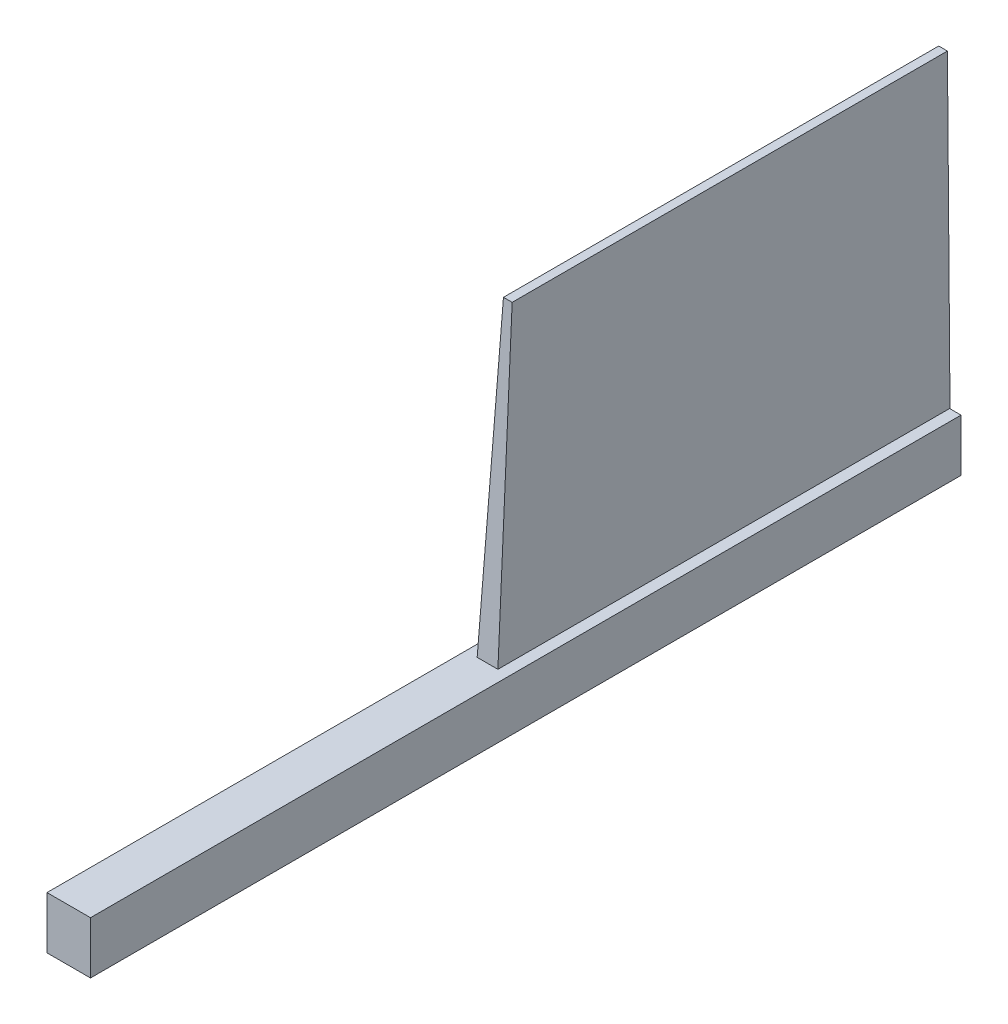
ISO-10303-21;
HEADER;
FILE_DESCRIPTION(('STEP AP214'),'2;1');
FILE_NAME('part.step','',(''),(''),'','','');
FILE_SCHEMA(('AUTOMOTIVE_DESIGN { 1 0 10303 214 1 1 1 1 }'));
ENDSEC;
DATA;
#1=APPLICATION_CONTEXT('core data for automotive mechanical design processes');
#2=APPLICATION_PROTOCOL_DEFINITION('international standard','automotive_design',2000,#1);
#3=PRODUCT_CONTEXT('',#1,'mechanical');
#4=PRODUCT('Part','Part','',(#3));
#5=PRODUCT_RELATED_PRODUCT_CATEGORY('part','',(#4));
#6=PRODUCT_DEFINITION_FORMATION('','',#4);
#7=PRODUCT_DEFINITION_CONTEXT('part definition',#1,'design');
#8=PRODUCT_DEFINITION('design','',#6,#7);
#9=PRODUCT_DEFINITION_SHAPE('','',#8);
#10=(LENGTH_UNIT() NAMED_UNIT(*) SI_UNIT(.MILLI.,.METRE.));
#11=(NAMED_UNIT(*) PLANE_ANGLE_UNIT() SI_UNIT($,.RADIAN.));
#12=(NAMED_UNIT(*) SI_UNIT($,.STERADIAN.) SOLID_ANGLE_UNIT());
#13=UNCERTAINTY_MEASURE_WITH_UNIT(LENGTH_MEASURE(1.E-05),#10,'distance_accuracy_value','');
#14=(GEOMETRIC_REPRESENTATION_CONTEXT(3) GLOBAL_UNCERTAINTY_ASSIGNED_CONTEXT((#13)) GLOBAL_UNIT_ASSIGNED_CONTEXT((#10,
#11,#12)) REPRESENTATION_CONTEXT('',''));
#15=CARTESIAN_POINT('',(0.,0.,0.));
#16=DIRECTION('',(0.,0.,1.));
#17=DIRECTION('',(1.,0.,0.));
#18=AXIS2_PLACEMENT_3D('',#15,#16,#17);
#19=CARTESIAN_POINT('',(-5.,5.99999999999999,200.));
#20=DIRECTION('',(0.,-1.,0.));
#21=DIRECTION('',(1.,0.,0.));
#22=AXIS2_PLACEMENT_3D('',#19,#20,#21);
#23=PLANE('',#22);
#24=DIRECTION('',(0.,0.,-1.));
#25=VECTOR('',#24,1.);
#26=CARTESIAN_POINT('',(2.38157894736841,5.99999999999999,200.));
#27=LINE('',#26,#25);
#28=CARTESIAN_POINT('',(2.38157894736844,5.99999999999994,103.783896454098));
#29=VERTEX_POINT('',#28);
#30=CARTESIAN_POINT('',(2.38157894736843,5.99999999999999,0.));
#31=VERTEX_POINT('',#30);
#32=EDGE_CURVE('E61',#29,#31,#27,.T.);
#33=ORIENTED_EDGE('',*,*,#32,.F.);
#34=DIRECTION('',(1.,0.,0.));
#35=VECTOR('',#34,1.);
#36=CARTESIAN_POINT('',(-5.00000000000001,5.99999999999994,103.783896454098));
#37=LINE('',#36,#35);
#38=CARTESIAN_POINT('',(-2.38157894736841,5.99999999999994,103.783896454098));
#39=VERTEX_POINT('',#38);
#40=EDGE_CURVE('E12',#39,#29,#37,.T.);
#41=ORIENTED_EDGE('',*,*,#40,.F.);
#42=DIRECTION('',(0.,0.,1.));
#43=VECTOR('',#42,1.);
#44=CARTESIAN_POINT('',(-2.38157894736842,5.99999999999999,200.));
#45=LINE('',#44,#43);
#46=CARTESIAN_POINT('',(-2.38157894736839,5.99999999999999,0.));
#47=VERTEX_POINT('',#46);
#48=EDGE_CURVE('E222',#47,#39,#45,.T.);
#49=ORIENTED_EDGE('',*,*,#48,.F.);
#50=DIRECTION('',(-1.,0.,0.));
#51=VECTOR('',#50,1.);
#52=CARTESIAN_POINT('',(-5.,6.00000000000001,0.));
#53=LINE('',#52,#51);
#54=CARTESIAN_POINT('',(-5.,6.00000000000001,0.));
#55=VERTEX_POINT('',#54);
#56=EDGE_CURVE('E236',#47,#55,#53,.T.);
#57=ORIENTED_EDGE('',*,*,#56,.T.);
#58=DIRECTION('',(0.,0.,-1.));
#59=VECTOR('',#58,1.);
#60=CARTESIAN_POINT('',(-5.,5.99999999999999,200.));
#61=LINE('',#60,#59);
#62=CARTESIAN_POINT('',(-5.,5.99999999999999,200.));
#63=VERTEX_POINT('',#62);
#64=EDGE_CURVE('E247',#63,#55,#61,.T.);
#65=ORIENTED_EDGE('',*,*,#64,.F.);
#66=DIRECTION('',(-1.,0.,0.));
#67=VECTOR('',#66,1.);
#68=CARTESIAN_POINT('',(-5.,5.99999999999999,200.));
#69=LINE('',#68,#67);
#70=CARTESIAN_POINT('',(5.,5.99999999999999,200.));
#71=VERTEX_POINT('',#70);
#72=EDGE_CURVE('E226',#71,#63,#69,.T.);
#73=ORIENTED_EDGE('',*,*,#72,.F.);
#74=DIRECTION('',(0.,0.,-1.));
#75=VECTOR('',#74,1.);
#76=CARTESIAN_POINT('',(5.,5.99999999999999,200.));
#77=LINE('',#76,#75);
#78=CARTESIAN_POINT('',(5.00000000000002,5.99999999999999,0.));
#79=VERTEX_POINT('',#78);
#80=EDGE_CURVE('E250',#71,#79,#77,.T.);
#81=ORIENTED_EDGE('',*,*,#80,.T.);
#82=EDGE_CURVE('E237',#79,#31,#53,.T.);
#83=ORIENTED_EDGE('',*,*,#82,.T.);
#84=EDGE_LOOP('',(#33,#41,#49,#57,#65,#73,#81,#83));
#85=FACE_BOUND('',#84,.T.);
#86=ADVANCED_FACE('F44',(#85),#23,.F.);
#87=CARTESIAN_POINT('',(0.,0.,0.));
#88=DIRECTION('',(0.,0.,1.));
#89=DIRECTION('',(1.,0.,0.));
#90=AXIS2_PLACEMENT_3D('',#87,#88,#89);
#91=PLANE('',#90);
#92=DIRECTION('',(0.0197329990542881,-0.999805285417277,0.));
#93=VECTOR('',#92,1.);
#94=CARTESIAN_POINT('',(2.49902652187082,0.0493228918790334,0.));
#95=LINE('',#94,#93);
#96=CARTESIAN_POINT('',(2.50000000000001,0.,0.));
#97=VERTEX_POINT('',#96);
#98=EDGE_CURVE('E53',#31,#97,#95,.T.);
#99=ORIENTED_EDGE('',*,*,#98,.F.);
#100=ORIENTED_EDGE('',*,*,#82,.F.);
#101=DIRECTION('',(0.,1.,0.));
#102=VECTOR('',#101,1.);
#103=CARTESIAN_POINT('',(5.00000000000002,5.99999999999999,0.));
#104=LINE('',#103,#102);
#105=CARTESIAN_POINT('',(5.00000000000001,-6.00000000000001,0.));
#106=VERTEX_POINT('',#105);
#107=EDGE_CURVE('E221',#106,#79,#104,.T.);
#108=ORIENTED_EDGE('',*,*,#107,.F.);
#109=DIRECTION('',(1.,0.,0.));
#110=VECTOR('',#109,1.);
#111=CARTESIAN_POINT('',(-5.,-6.00000000000001,0.));
#112=LINE('',#111,#110);
#113=CARTESIAN_POINT('',(-5.,-6.00000000000001,0.));
#114=VERTEX_POINT('',#113);
#115=EDGE_CURVE('E227',#114,#106,#112,.T.);
#116=ORIENTED_EDGE('',*,*,#115,.F.);
#117=DIRECTION('',(0.,-1.,0.));
#118=VECTOR('',#117,1.);
#119=CARTESIAN_POINT('',(-5.,6.00000000000001,0.));
#120=LINE('',#119,#118);
#121=EDGE_CURVE('E239',#55,#114,#120,.T.);
#122=ORIENTED_EDGE('',*,*,#121,.F.);
#123=ORIENTED_EDGE('',*,*,#56,.F.);
#124=DIRECTION('',(0.0197329990542884,0.999805285417277,0.));
#125=VECTOR('',#124,1.);
#126=CARTESIAN_POINT('',(-2.49902652187078,0.0493228918790334,0.));
#127=LINE('',#126,#125);
#128=CARTESIAN_POINT('',(-2.49999999999997,0.,0.));
#129=VERTEX_POINT('',#128);
#130=EDGE_CURVE('E253',#129,#47,#127,.T.);
#131=ORIENTED_EDGE('',*,*,#130,.F.);
#132=DIRECTION('',(-1.,0.,0.));
#133=VECTOR('',#132,1.);
#134=CARTESIAN_POINT('',(0.,0.,0.));
#135=LINE('',#134,#133);
#136=EDGE_CURVE('E150',#97,#129,#135,.T.);
#137=ORIENTED_EDGE('',*,*,#136,.F.);
#138=EDGE_LOOP('',(#99,#100,#108,#116,#122,#123,#131,#137));
#139=FACE_BOUND('',#138,.T.);
#140=ADVANCED_FACE('F360',(#139),#91,.F.);
#141=CARTESIAN_POINT('',(5.,5.99999999999999,200.));
#142=DIRECTION('',(-1.,0.,0.));
#143=DIRECTION('',(0.,-1.,0.));
#144=AXIS2_PLACEMENT_3D('',#141,#142,#143);
#145=PLANE('',#144);
#146=ORIENTED_EDGE('',*,*,#107,.T.);
#147=ORIENTED_EDGE('',*,*,#80,.F.);
#148=DIRECTION('',(0.,1.,0.));
#149=VECTOR('',#148,1.);
#150=CARTESIAN_POINT('',(5.,5.99999999999999,200.));
#151=LINE('',#150,#149);
#152=CARTESIAN_POINT('',(5.00000000000002,-6.00000000000001,200.));
#153=VERTEX_POINT('',#152);
#154=EDGE_CURVE('E223',#153,#71,#151,.T.);
#155=ORIENTED_EDGE('',*,*,#154,.F.);
#156=DIRECTION('',(0.,0.,-1.));
#157=VECTOR('',#156,1.);
#158=CARTESIAN_POINT('',(5.00000000000002,-6.00000000000001,200.));
#159=LINE('',#158,#157);
#160=EDGE_CURVE('E233',#153,#106,#159,.T.);
#161=ORIENTED_EDGE('',*,*,#160,.T.);
#162=EDGE_LOOP('',(#146,#147,#155,#161));
#163=FACE_BOUND('',#162,.T.);
#164=ADVANCED_FACE('F46',(#163),#145,.F.);
#165=CARTESIAN_POINT('',(-5.,5.99999999999999,200.));
#166=DIRECTION('',(1.,0.,0.));
#167=DIRECTION('',(0.,1.,0.));
#168=AXIS2_PLACEMENT_3D('',#165,#166,#167);
#169=PLANE('',#168);
#170=ORIENTED_EDGE('',*,*,#121,.T.);
#171=DIRECTION('',(0.,0.,-1.));
#172=VECTOR('',#171,1.);
#173=CARTESIAN_POINT('',(-4.99999999999999,-6.00000000000001,200.));
#174=LINE('',#173,#172);
#175=CARTESIAN_POINT('',(-4.99999999999999,-6.00000000000001,200.));
#176=VERTEX_POINT('',#175);
#177=EDGE_CURVE('E244',#176,#114,#174,.T.);
#178=ORIENTED_EDGE('',*,*,#177,.F.);
#179=DIRECTION('',(0.,-1.,0.));
#180=VECTOR('',#179,1.);
#181=CARTESIAN_POINT('',(-5.,5.99999999999999,200.));
#182=LINE('',#181,#180);
#183=EDGE_CURVE('E229',#63,#176,#182,.T.);
#184=ORIENTED_EDGE('',*,*,#183,.F.);
#185=ORIENTED_EDGE('',*,*,#64,.T.);
#186=EDGE_LOOP('',(#170,#178,#184,#185));
#187=FACE_BOUND('',#186,.T.);
#188=ADVANCED_FACE('F375',(#187),#169,.F.);
#189=CARTESIAN_POINT('',(-4.99999999999999,-6.00000000000001,200.));
#190=DIRECTION('',(0.,1.,0.));
#191=DIRECTION('',(0.,0.,1.));
#192=AXIS2_PLACEMENT_3D('',#189,#190,#191);
#193=PLANE('',#192);
#194=ORIENTED_EDGE('',*,*,#115,.T.);
#195=ORIENTED_EDGE('',*,*,#160,.F.);
#196=DIRECTION('',(1.,0.,0.));
#197=VECTOR('',#196,1.);
#198=CARTESIAN_POINT('',(-4.99999999999999,-6.00000000000001,200.));
#199=LINE('',#198,#197);
#200=EDGE_CURVE('E231',#176,#153,#199,.T.);
#201=ORIENTED_EDGE('',*,*,#200,.F.);
#202=ORIENTED_EDGE('',*,*,#177,.T.);
#203=EDGE_LOOP('',(#194,#195,#201,#202));
#204=FACE_BOUND('',#203,.T.);
#205=ADVANCED_FACE('F370',(#204),#193,.F.);
#206=CARTESIAN_POINT('',(0.,0.,200.));
#207=DIRECTION('',(0.,0.,1.));
#208=DIRECTION('',(1.,0.,0.));
#209=AXIS2_PLACEMENT_3D('',#206,#207,#208);
#210=PLANE('',#209);
#211=ORIENTED_EDGE('',*,*,#154,.T.);
#212=ORIENTED_EDGE('',*,*,#72,.T.);
#213=ORIENTED_EDGE('',*,*,#183,.T.);
#214=ORIENTED_EDGE('',*,*,#200,.T.);
#215=EDGE_LOOP('',(#211,#212,#213,#214));
#216=FACE_BOUND('',#215,.T.);
#217=ADVANCED_FACE('F331',(#216),#210,.T.);
#218=CARTESIAN_POINT('',(0.,6.90503196894718,103.72364717779));
#219=DIRECTION('',(0.,-0.0664244086867444,-0.997791460141156));
#220=DIRECTION('',(0.,0.997791460141154,-0.0664244086867445));
#221=AXIS2_PLACEMENT_3D('',#218,#219,#220);
#222=PLANE('',#221);
#223=DIRECTION('',(0.0196894348532918,0.997598032566782,-0.0664115319356751));
#224=VECTOR('',#223,1.);
#225=CARTESIAN_POINT('',(-2.49999999999999,0.,104.183325060216));
#226=LINE('',#225,#224);
#227=CARTESIAN_POINT('',(-0.999999999999989,75.9999999999999,99.1238960493903));
#228=VERTEX_POINT('',#227);
#229=EDGE_CURVE('E286',#39,#228,#226,.T.);
#230=ORIENTED_EDGE('',*,*,#229,.F.);
#231=ORIENTED_EDGE('',*,*,#40,.T.);
#232=DIRECTION('',(-0.0196894348532918,0.997598032566782,-0.0664115319356751));
#233=VECTOR('',#232,1.);
#234=CARTESIAN_POINT('',(2.50000000000001,0.,104.183325060216));
#235=LINE('',#234,#233);
#236=CARTESIAN_POINT('',(1.00000000000002,75.9999999999999,99.1238960493903));
#237=VERTEX_POINT('',#236);
#238=EDGE_CURVE('E217',#29,#237,#235,.T.);
#239=ORIENTED_EDGE('',*,*,#238,.T.);
#240=DIRECTION('',(1.,0.,0.));
#241=VECTOR('',#240,1.);
#242=CARTESIAN_POINT('',(-0.999999999999989,75.9999999999999,99.1238960493903));
#243=LINE('',#242,#241);
#244=EDGE_CURVE('E270',#228,#237,#243,.T.);
#245=ORIENTED_EDGE('',*,*,#244,.F.);
#246=EDGE_LOOP('',(#230,#231,#239,#245));
#247=FACE_BOUND('',#246,.T.);
#248=ADVANCED_FACE('F170',(#247),#222,.F.);
#249=CARTESIAN_POINT('',(0.,0.,0.));
#250=DIRECTION('',(0.,1.,0.));
#251=DIRECTION('',(0.,0.,1.));
#252=AXIS2_PLACEMENT_3D('',#249,#250,#251);
#253=PLANE('',#252);
#254=DIRECTION('',(0.,0.,-1.));
#255=VECTOR('',#254,1.);
#256=CARTESIAN_POINT('',(2.50000000000001,0.,-0.0200279663921943));
#257=LINE('',#256,#255);
#258=CARTESIAN_POINT('',(2.50000000000001,0.,-0.0200279663921943));
#259=VERTEX_POINT('',#258);
#260=EDGE_CURVE('E144',#97,#259,#257,.T.);
#261=ORIENTED_EDGE('',*,*,#260,.F.);
#262=ORIENTED_EDGE('',*,*,#136,.T.);
#263=DIRECTION('',(0.,0.,1.));
#264=VECTOR('',#263,1.);
#265=CARTESIAN_POINT('',(-2.5,0.,-0.0200279663921943));
#266=LINE('',#265,#264);
#267=CARTESIAN_POINT('',(-2.5,0.,-0.0200279663921943));
#268=VERTEX_POINT('',#267);
#269=EDGE_CURVE('E127',#268,#129,#266,.T.);
#270=ORIENTED_EDGE('',*,*,#269,.F.);
#271=DIRECTION('',(-1.,0.,0.));
#272=VECTOR('',#271,1.);
#273=CARTESIAN_POINT('',(-2.5,0.,-0.0200279663921943));
#274=LINE('',#273,#272);
#275=EDGE_CURVE('E135',#259,#268,#274,.T.);
#276=ORIENTED_EDGE('',*,*,#275,.F.);
#277=EDGE_LOOP('',(#261,#262,#270,#276));
#278=FACE_BOUND('',#277,.T.);
#279=ADVANCED_FACE('F149',(#278),#253,.F.);
#280=CARTESIAN_POINT('',(2.49902652187082,0.0493228918790334,0.));
#281=DIRECTION('',(-0.999805285417279,-0.0197329990542881,0.));
#282=DIRECTION('',(0.0197329990542881,-0.999805285417277,0.));
#283=AXIS2_PLACEMENT_3D('',#280,#281,#282);
#284=PLANE('',#283);
#285=ORIENTED_EDGE('',*,*,#238,.F.);
#286=ORIENTED_EDGE('',*,*,#32,.T.);
#287=ORIENTED_EDGE('',*,*,#98,.T.);
#288=ORIENTED_EDGE('',*,*,#260,.T.);
#289=DIRECTION('',(-0.0197317477870036,0.999741887874863,-0.0112612502713972));
#290=VECTOR('',#289,1.);
#291=CARTESIAN_POINT('',(2.50000000000001,0.,-0.0200279663921943));
#292=LINE('',#291,#290);
#293=CARTESIAN_POINT('',(1.00000000000004,76.,-0.876103950609941));
#294=VERTEX_POINT('',#293);
#295=EDGE_CURVE('E134',#259,#294,#292,.T.);
#296=ORIENTED_EDGE('',*,*,#295,.T.);
#297=DIRECTION('',(0.,0.,-1.));
#298=VECTOR('',#297,1.);
#299=CARTESIAN_POINT('',(1.00000000000004,76.,-0.876103950609941));
#300=LINE('',#299,#298);
#301=EDGE_CURVE('E265',#237,#294,#300,.T.);
#302=ORIENTED_EDGE('',*,*,#301,.F.);
#303=EDGE_LOOP('',(#285,#286,#287,#288,#296,#302));
#304=FACE_BOUND('',#303,.T.);
#305=ADVANCED_FACE('F169',(#304),#284,.F.);
#306=CARTESIAN_POINT('',(-2.49902652187078,0.0493228918790334,0.));
#307=DIRECTION('',(0.999805285417279,-0.0197329990542883,0.));
#308=DIRECTION('',(0.0197329990542884,0.999805285417277,0.));
#309=AXIS2_PLACEMENT_3D('',#306,#307,#308);
#310=PLANE('',#309);
#311=ORIENTED_EDGE('',*,*,#130,.T.);
#312=ORIENTED_EDGE('',*,*,#48,.T.);
#313=ORIENTED_EDGE('',*,*,#229,.T.);
#314=DIRECTION('',(0.,0.,1.));
#315=VECTOR('',#314,1.);
#316=CARTESIAN_POINT('',(-0.999999999999977,76.,-0.876103950609941));
#317=LINE('',#316,#315);
#318=CARTESIAN_POINT('',(-0.999999999999977,76.,-0.876103950609941));
#319=VERTEX_POINT('',#318);
#320=EDGE_CURVE('E130',#319,#228,#317,.T.);
#321=ORIENTED_EDGE('',*,*,#320,.F.);
#322=DIRECTION('',(0.0197317477870042,0.999741887874863,-0.0112612502713972));
#323=VECTOR('',#322,1.);
#324=CARTESIAN_POINT('',(-2.5,0.,-0.0200279663921943));
#325=LINE('',#324,#323);
#326=EDGE_CURVE('E122',#268,#319,#325,.T.);
#327=ORIENTED_EDGE('',*,*,#326,.F.);
#328=ORIENTED_EDGE('',*,*,#269,.T.);
#329=EDGE_LOOP('',(#311,#312,#313,#321,#327,#328));
#330=FACE_BOUND('',#329,.T.);
#331=ADVANCED_FACE('F125',(#330),#310,.F.);
#332=CARTESIAN_POINT('',(0.,76.,0.));
#333=DIRECTION('',(0.,1.,0.));
#334=DIRECTION('',(0.,0.,1.));
#335=AXIS2_PLACEMENT_3D('',#332,#333,#334);
#336=PLANE('',#335);
#337=ORIENTED_EDGE('',*,*,#320,.T.);
#338=ORIENTED_EDGE('',*,*,#244,.T.);
#339=ORIENTED_EDGE('',*,*,#301,.T.);
#340=DIRECTION('',(-1.,0.,0.));
#341=VECTOR('',#340,1.);
#342=CARTESIAN_POINT('',(-0.999999999999977,76.,-0.876103950609941));
#343=LINE('',#342,#341);
#344=EDGE_CURVE('E263',#294,#319,#343,.T.);
#345=ORIENTED_EDGE('',*,*,#344,.T.);
#346=EDGE_LOOP('',(#337,#338,#339,#345));
#347=FACE_BOUND('',#346,.T.);
#348=ADVANCED_FACE('F332',(#347),#336,.T.);
#349=CARTESIAN_POINT('',(0.,-0.000225569551051685,-0.0200254255411925));
#350=DIRECTION('',(0.,0.0112634431498762,0.999936565412233));
#351=DIRECTION('',(0.,-0.999936565412231,0.0112634431498762));
#352=AXIS2_PLACEMENT_3D('',#349,#350,#351);
#353=PLANE('',#352);
#354=ORIENTED_EDGE('',*,*,#326,.T.);
#355=ORIENTED_EDGE('',*,*,#344,.F.);
#356=ORIENTED_EDGE('',*,*,#295,.F.);
#357=ORIENTED_EDGE('',*,*,#275,.T.);
#358=EDGE_LOOP('',(#354,#355,#356,#357));
#359=FACE_BOUND('',#358,.T.);
#360=ADVANCED_FACE('F140',(#359),#353,.F.);
#361=CLOSED_SHELL('',(#86,#140,#164,#188,#205,#217,#248,#279,#305,#331,#348,#360));
#362=MANIFOLD_SOLID_BREP('B2',#361);
#363=ADVANCED_BREP_SHAPE_REPRESENTATION('',(#18,#362),#14);
#364=SHAPE_DEFINITION_REPRESENTATION(#9,#363);
ENDSEC;
END-ISO-10303-21;
